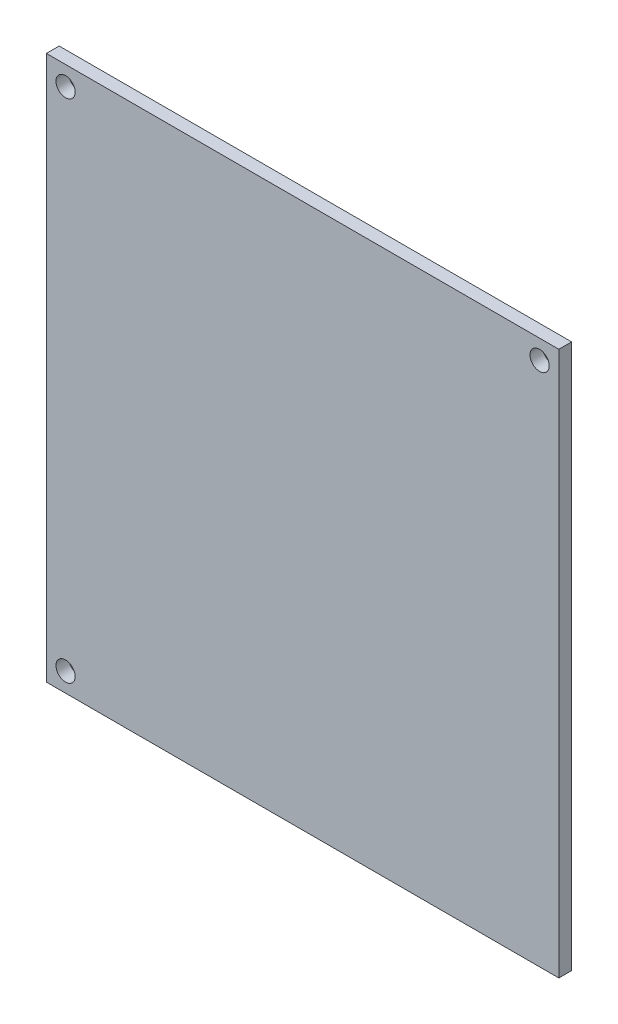
ISO-10303-21;
HEADER;
FILE_DESCRIPTION(('STEP AP214'),'2;1');
FILE_NAME('part.step','',(''),(''),'','','');
FILE_SCHEMA(('AUTOMOTIVE_DESIGN { 1 0 10303 214 1 1 1 1 }'));
ENDSEC;
DATA;
#1=APPLICATION_CONTEXT('core data for automotive mechanical design processes');
#2=APPLICATION_PROTOCOL_DEFINITION('international standard','automotive_design',2000,#1);
#3=PRODUCT_CONTEXT('',#1,'mechanical');
#4=PRODUCT('Part','Part','',(#3));
#5=PRODUCT_RELATED_PRODUCT_CATEGORY('part','',(#4));
#6=PRODUCT_DEFINITION_FORMATION('','',#4);
#7=PRODUCT_DEFINITION_CONTEXT('part definition',#1,'design');
#8=PRODUCT_DEFINITION('design','',#6,#7);
#9=PRODUCT_DEFINITION_SHAPE('','',#8);
#10=(LENGTH_UNIT() NAMED_UNIT(*) SI_UNIT(.MILLI.,.METRE.));
#11=(NAMED_UNIT(*) PLANE_ANGLE_UNIT() SI_UNIT($,.RADIAN.));
#12=(NAMED_UNIT(*) SI_UNIT($,.STERADIAN.) SOLID_ANGLE_UNIT());
#13=UNCERTAINTY_MEASURE_WITH_UNIT(LENGTH_MEASURE(1.E-05),#10,'distance_accuracy_value','');
#14=(GEOMETRIC_REPRESENTATION_CONTEXT(3) GLOBAL_UNCERTAINTY_ASSIGNED_CONTEXT((#13)) GLOBAL_UNIT_ASSIGNED_CONTEXT((#10,
#11,#12)) REPRESENTATION_CONTEXT('',''));
#15=CARTESIAN_POINT('',(0.,0.,0.));
#16=DIRECTION('',(0.,0.,1.));
#17=DIRECTION('',(1.,0.,0.));
#18=AXIS2_PLACEMENT_3D('',#15,#16,#17);
#19=CARTESIAN_POINT('',(0.,0.,2.));
#20=DIRECTION('',(0.,0.,-1.));
#21=DIRECTION('',(-1.,0.,0.));
#22=AXIS2_PLACEMENT_3D('',#19,#20,#21);
#23=PLANE('',#22);
#24=DIRECTION('',(0.,-1.,0.));
#25=VECTOR('',#24,1.);
#26=CARTESIAN_POINT('',(0.,0.,2.));
#27=LINE('',#26,#25);
#28=CARTESIAN_POINT('',(0.,85.,2.));
#29=VERTEX_POINT('',#28);
#30=CARTESIAN_POINT('',(0.,0.,2.));
#31=VERTEX_POINT('',#30);
#32=EDGE_CURVE('E92',#29,#31,#27,.T.);
#33=ORIENTED_EDGE('',*,*,#32,.T.);
#34=DIRECTION('',(1.,0.,0.));
#35=VECTOR('',#34,1.);
#36=CARTESIAN_POINT('',(0.,0.,2.));
#37=LINE('',#36,#35);
#38=CARTESIAN_POINT('',(80.,0.,2.));
#39=VERTEX_POINT('',#38);
#40=EDGE_CURVE('E87',#31,#39,#37,.T.);
#41=ORIENTED_EDGE('',*,*,#40,.T.);
#42=DIRECTION('',(0.,1.,0.));
#43=VECTOR('',#42,1.);
#44=CARTESIAN_POINT('',(80.,0.,2.));
#45=LINE('',#44,#43);
#46=CARTESIAN_POINT('',(80.,85.,2.));
#47=VERTEX_POINT('',#46);
#48=EDGE_CURVE('E90',#39,#47,#45,.T.);
#49=ORIENTED_EDGE('',*,*,#48,.T.);
#50=DIRECTION('',(-1.,0.,0.));
#51=VECTOR('',#50,1.);
#52=CARTESIAN_POINT('',(0.,85.,2.));
#53=LINE('',#52,#51);
#54=EDGE_CURVE('E57',#47,#29,#53,.T.);
#55=ORIENTED_EDGE('',*,*,#54,.T.);
#56=EDGE_LOOP('',(#33,#41,#49,#55));
#57=FACE_BOUND('',#56,.T.);
#58=CARTESIAN_POINT('',(3.,3.,2.));
#59=DIRECTION('',(0.,0.,1.));
#60=DIRECTION('',(1.,0.,0.));
#61=AXIS2_PLACEMENT_3D('',#58,#59,#60);
#62=CIRCLE('',#61,1.5);
#63=CARTESIAN_POINT('',(4.5,3.,2.));
#64=VERTEX_POINT('',#63);
#65=EDGE_CURVE('E112',#64,#64,#62,.T.);
#66=ORIENTED_EDGE('',*,*,#65,.F.);
#67=EDGE_LOOP('',(#66));
#68=FACE_BOUND('',#67,.T.);
#69=CARTESIAN_POINT('',(77.,82.,2.));
#70=DIRECTION('',(0.,0.,1.));
#71=DIRECTION('',(1.,0.,0.));
#72=AXIS2_PLACEMENT_3D('',#69,#70,#71);
#73=CIRCLE('',#72,1.5);
#74=CARTESIAN_POINT('',(78.5,82.,2.));
#75=VERTEX_POINT('',#74);
#76=EDGE_CURVE('E134',#75,#75,#73,.T.);
#77=ORIENTED_EDGE('',*,*,#76,.F.);
#78=EDGE_LOOP('',(#77));
#79=FACE_BOUND('',#78,.T.);
#80=CARTESIAN_POINT('',(3.,82.,2.));
#81=DIRECTION('',(0.,0.,1.));
#82=DIRECTION('',(1.,0.,0.));
#83=AXIS2_PLACEMENT_3D('',#80,#81,#82);
#84=CIRCLE('',#83,1.5);
#85=CARTESIAN_POINT('',(4.5,82.,2.));
#86=VERTEX_POINT('',#85);
#87=EDGE_CURVE('E142',#86,#86,#84,.T.);
#88=ORIENTED_EDGE('',*,*,#87,.F.);
#89=EDGE_LOOP('',(#88));
#90=FACE_BOUND('',#89,.T.);
#91=ADVANCED_FACE('F39',(#57,#68,#79,#90),#23,.F.);
#92=CARTESIAN_POINT('',(0.,0.,0.));
#93=DIRECTION('',(0.,0.,-1.));
#94=DIRECTION('',(-1.,0.,0.));
#95=AXIS2_PLACEMENT_3D('',#92,#93,#94);
#96=PLANE('',#95);
#97=CARTESIAN_POINT('',(77.,82.,0.));
#98=DIRECTION('',(0.,0.,1.));
#99=DIRECTION('',(1.,0.,0.));
#100=AXIS2_PLACEMENT_3D('',#97,#98,#99);
#101=CIRCLE('',#100,1.5);
#102=CARTESIAN_POINT('',(78.5,82.,0.));
#103=VERTEX_POINT('',#102);
#104=EDGE_CURVE('E138',#103,#103,#101,.T.);
#105=ORIENTED_EDGE('',*,*,#104,.T.);
#106=EDGE_LOOP('',(#105));
#107=FACE_BOUND('',#106,.T.);
#108=DIRECTION('',(0.,-1.,0.));
#109=VECTOR('',#108,1.);
#110=CARTESIAN_POINT('',(0.,0.,0.));
#111=LINE('',#110,#109);
#112=CARTESIAN_POINT('',(0.,85.,0.));
#113=VERTEX_POINT('',#112);
#114=CARTESIAN_POINT('',(0.,0.,0.));
#115=VERTEX_POINT('',#114);
#116=EDGE_CURVE('E108',#113,#115,#111,.T.);
#117=ORIENTED_EDGE('',*,*,#116,.F.);
#118=DIRECTION('',(-1.,0.,0.));
#119=VECTOR('',#118,1.);
#120=CARTESIAN_POINT('',(0.,85.,0.));
#121=LINE('',#120,#119);
#122=CARTESIAN_POINT('',(80.,85.,0.));
#123=VERTEX_POINT('',#122);
#124=EDGE_CURVE('E80',#123,#113,#121,.T.);
#125=ORIENTED_EDGE('',*,*,#124,.F.);
#126=DIRECTION('',(0.,1.,0.));
#127=VECTOR('',#126,1.);
#128=CARTESIAN_POINT('',(80.,0.,0.));
#129=LINE('',#128,#127);
#130=CARTESIAN_POINT('',(80.,0.,0.));
#131=VERTEX_POINT('',#130);
#132=EDGE_CURVE('E74',#131,#123,#129,.T.);
#133=ORIENTED_EDGE('',*,*,#132,.F.);
#134=DIRECTION('',(1.,0.,0.));
#135=VECTOR('',#134,1.);
#136=CARTESIAN_POINT('',(0.,0.,0.));
#137=LINE('',#136,#135);
#138=EDGE_CURVE('E97',#115,#131,#137,.T.);
#139=ORIENTED_EDGE('',*,*,#138,.F.);
#140=EDGE_LOOP('',(#117,#125,#133,#139));
#141=FACE_BOUND('',#140,.T.);
#142=CARTESIAN_POINT('',(3.,3.,0.));
#143=DIRECTION('',(0.,0.,1.));
#144=DIRECTION('',(1.,0.,0.));
#145=AXIS2_PLACEMENT_3D('',#142,#143,#144);
#146=CIRCLE('',#145,1.5);
#147=CARTESIAN_POINT('',(4.5,3.,0.));
#148=VERTEX_POINT('',#147);
#149=EDGE_CURVE('E130',#148,#148,#146,.T.);
#150=ORIENTED_EDGE('',*,*,#149,.T.);
#151=EDGE_LOOP('',(#150));
#152=FACE_BOUND('',#151,.T.);
#153=CARTESIAN_POINT('',(3.,82.,0.));
#154=DIRECTION('',(0.,0.,1.));
#155=DIRECTION('',(1.,0.,0.));
#156=AXIS2_PLACEMENT_3D('',#153,#154,#155);
#157=CIRCLE('',#156,1.5);
#158=CARTESIAN_POINT('',(4.5,82.,0.));
#159=VERTEX_POINT('',#158);
#160=EDGE_CURVE('E146',#159,#159,#157,.T.);
#161=ORIENTED_EDGE('',*,*,#160,.T.);
#162=EDGE_LOOP('',(#161));
#163=FACE_BOUND('',#162,.T.);
#164=ADVANCED_FACE('F125',(#107,#141,#152,#163),#96,.T.);
#165=CARTESIAN_POINT('',(0.,0.,2.));
#166=DIRECTION('',(1.,0.,0.));
#167=DIRECTION('',(0.,0.,-1.));
#168=AXIS2_PLACEMENT_3D('',#165,#166,#167);
#169=PLANE('',#168);
#170=ORIENTED_EDGE('',*,*,#116,.T.);
#171=DIRECTION('',(0.,0.,-1.));
#172=VECTOR('',#171,1.);
#173=CARTESIAN_POINT('',(0.,0.,2.));
#174=LINE('',#173,#172);
#175=EDGE_CURVE('E11',#31,#115,#174,.T.);
#176=ORIENTED_EDGE('',*,*,#175,.F.);
#177=ORIENTED_EDGE('',*,*,#32,.F.);
#178=DIRECTION('',(0.,0.,-1.));
#179=VECTOR('',#178,1.);
#180=CARTESIAN_POINT('',(0.,85.,2.));
#181=LINE('',#180,#179);
#182=EDGE_CURVE('E104',#29,#113,#181,.T.);
#183=ORIENTED_EDGE('',*,*,#182,.T.);
#184=EDGE_LOOP('',(#170,#176,#177,#183));
#185=FACE_BOUND('',#184,.T.);
#186=ADVANCED_FACE('F41',(#185),#169,.F.);
#187=CARTESIAN_POINT('',(0.,0.,2.));
#188=DIRECTION('',(0.,1.,0.));
#189=DIRECTION('',(0.,0.,1.));
#190=AXIS2_PLACEMENT_3D('',#187,#188,#189);
#191=PLANE('',#190);
#192=ORIENTED_EDGE('',*,*,#138,.T.);
#193=DIRECTION('',(0.,0.,-1.));
#194=VECTOR('',#193,1.);
#195=CARTESIAN_POINT('',(80.,0.,2.));
#196=LINE('',#195,#194);
#197=EDGE_CURVE('E49',#39,#131,#196,.T.);
#198=ORIENTED_EDGE('',*,*,#197,.F.);
#199=ORIENTED_EDGE('',*,*,#40,.F.);
#200=ORIENTED_EDGE('',*,*,#175,.T.);
#201=EDGE_LOOP('',(#192,#198,#199,#200));
#202=FACE_BOUND('',#201,.T.);
#203=ADVANCED_FACE('F96',(#202),#191,.F.);
#204=CARTESIAN_POINT('',(80.,0.,2.));
#205=DIRECTION('',(-1.,0.,0.));
#206=DIRECTION('',(0.,0.,1.));
#207=AXIS2_PLACEMENT_3D('',#204,#205,#206);
#208=PLANE('',#207);
#209=ORIENTED_EDGE('',*,*,#132,.T.);
#210=DIRECTION('',(0.,0.,-1.));
#211=VECTOR('',#210,1.);
#212=CARTESIAN_POINT('',(80.,85.,2.));
#213=LINE('',#212,#211);
#214=EDGE_CURVE('E99',#47,#123,#213,.T.);
#215=ORIENTED_EDGE('',*,*,#214,.F.);
#216=ORIENTED_EDGE('',*,*,#48,.F.);
#217=ORIENTED_EDGE('',*,*,#197,.T.);
#218=EDGE_LOOP('',(#209,#215,#216,#217));
#219=FACE_BOUND('',#218,.T.);
#220=ADVANCED_FACE('F100',(#219),#208,.F.);
#221=CARTESIAN_POINT('',(0.,85.,2.));
#222=DIRECTION('',(0.,-1.,0.));
#223=DIRECTION('',(0.,0.,-1.));
#224=AXIS2_PLACEMENT_3D('',#221,#222,#223);
#225=PLANE('',#224);
#226=ORIENTED_EDGE('',*,*,#124,.T.);
#227=ORIENTED_EDGE('',*,*,#182,.F.);
#228=ORIENTED_EDGE('',*,*,#54,.F.);
#229=ORIENTED_EDGE('',*,*,#214,.T.);
#230=EDGE_LOOP('',(#226,#227,#228,#229));
#231=FACE_BOUND('',#230,.T.);
#232=ADVANCED_FACE('F122',(#231),#225,.F.);
#233=CARTESIAN_POINT('',(3.,3.,2.));
#234=DIRECTION('',(0.,0.,-1.));
#235=DIRECTION('',(-1.,0.,0.));
#236=AXIS2_PLACEMENT_3D('',#233,#234,#235);
#237=CYLINDRICAL_SURFACE('',#236,1.5);
#238=ORIENTED_EDGE('',*,*,#65,.T.);
#239=EDGE_LOOP('',(#238));
#240=FACE_BOUND('',#239,.T.);
#241=ORIENTED_EDGE('',*,*,#149,.F.);
#242=EDGE_LOOP('',(#241));
#243=FACE_BOUND('',#242,.T.);
#244=ADVANCED_FACE('F165',(#240,#243),#237,.F.);
#245=CARTESIAN_POINT('',(77.,82.,2.));
#246=DIRECTION('',(0.,0.,-1.));
#247=DIRECTION('',(-1.,0.,0.));
#248=AXIS2_PLACEMENT_3D('',#245,#246,#247);
#249=CYLINDRICAL_SURFACE('',#248,1.5);
#250=ORIENTED_EDGE('',*,*,#76,.T.);
#251=EDGE_LOOP('',(#250));
#252=FACE_BOUND('',#251,.T.);
#253=ORIENTED_EDGE('',*,*,#104,.F.);
#254=EDGE_LOOP('',(#253));
#255=FACE_BOUND('',#254,.T.);
#256=ADVANCED_FACE('F211',(#252,#255),#249,.F.);
#257=CARTESIAN_POINT('',(3.,82.,2.));
#258=DIRECTION('',(0.,0.,-1.));
#259=DIRECTION('',(-1.,0.,0.));
#260=AXIS2_PLACEMENT_3D('',#257,#258,#259);
#261=CYLINDRICAL_SURFACE('',#260,1.5);
#262=ORIENTED_EDGE('',*,*,#87,.T.);
#263=EDGE_LOOP('',(#262));
#264=FACE_BOUND('',#263,.T.);
#265=ORIENTED_EDGE('',*,*,#160,.F.);
#266=EDGE_LOOP('',(#265));
#267=FACE_BOUND('',#266,.T.);
#268=ADVANCED_FACE('F154',(#264,#267),#261,.F.);
#269=CLOSED_SHELL('',(#91,#164,#186,#203,#220,#232,#244,#256,#268));
#270=MANIFOLD_SOLID_BREP('B2',#269);
#271=ADVANCED_BREP_SHAPE_REPRESENTATION('',(#18,#270),#14);
#272=SHAPE_DEFINITION_REPRESENTATION(#9,#271);
ENDSEC;
END-ISO-10303-21;
